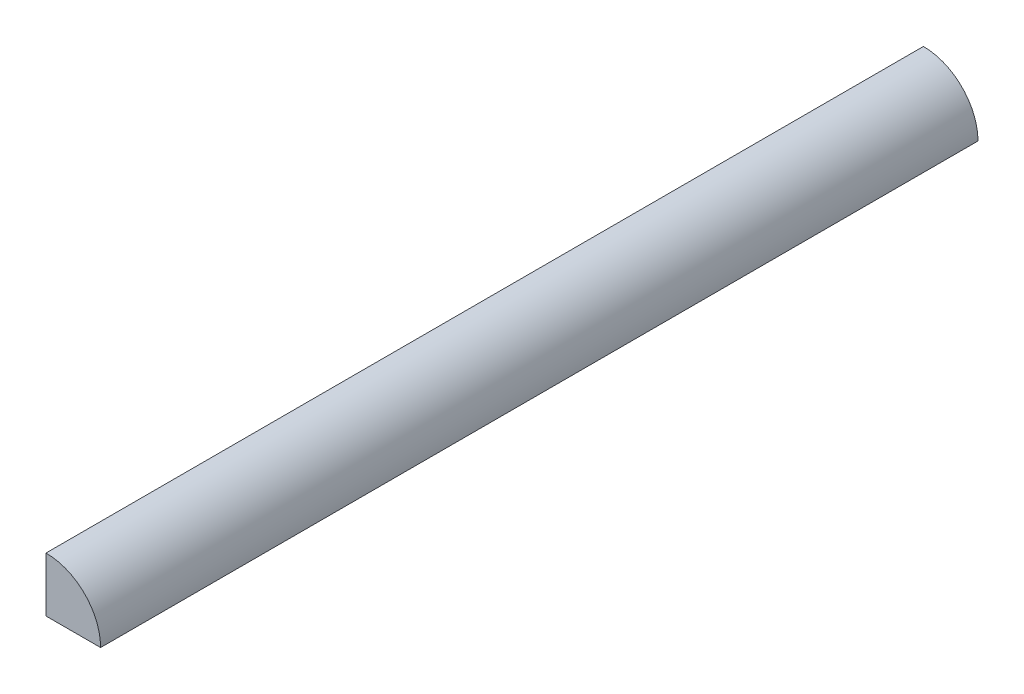
ISO-10303-21;
HEADER;
FILE_DESCRIPTION(('STEP AP214'),'2;1');
FILE_NAME('part.step','',(''),(''),'','','');
FILE_SCHEMA(('AUTOMOTIVE_DESIGN { 1 0 10303 214 1 1 1 1 }'));
ENDSEC;
DATA;
#1=APPLICATION_CONTEXT('core data for automotive mechanical design processes');
#2=APPLICATION_PROTOCOL_DEFINITION('international standard','automotive_design',2000,#1);
#3=PRODUCT_CONTEXT('',#1,'mechanical');
#4=PRODUCT('Part','Part','',(#3));
#5=PRODUCT_RELATED_PRODUCT_CATEGORY('part','',(#4));
#6=PRODUCT_DEFINITION_FORMATION('','',#4);
#7=PRODUCT_DEFINITION_CONTEXT('part definition',#1,'design');
#8=PRODUCT_DEFINITION('design','',#6,#7);
#9=PRODUCT_DEFINITION_SHAPE('','',#8);
#10=(LENGTH_UNIT() NAMED_UNIT(*) SI_UNIT(.MILLI.,.METRE.));
#11=(NAMED_UNIT(*) PLANE_ANGLE_UNIT() SI_UNIT($,.RADIAN.));
#12=(NAMED_UNIT(*) SI_UNIT($,.STERADIAN.) SOLID_ANGLE_UNIT());
#13=UNCERTAINTY_MEASURE_WITH_UNIT(LENGTH_MEASURE(1.E-05),#10,'distance_accuracy_value','');
#14=(GEOMETRIC_REPRESENTATION_CONTEXT(3) GLOBAL_UNCERTAINTY_ASSIGNED_CONTEXT((#13)) GLOBAL_UNIT_ASSIGNED_CONTEXT((#10,
#11,#12)) REPRESENTATION_CONTEXT('',''));
#15=CARTESIAN_POINT('',(0.,0.,0.));
#16=DIRECTION('',(0.,0.,1.));
#17=DIRECTION('',(1.,0.,0.));
#18=AXIS2_PLACEMENT_3D('',#15,#16,#17);
#19=CARTESIAN_POINT('',(0.,-28.,450.));
#20=DIRECTION('',(0.,0.,-1.));
#21=DIRECTION('',(-1.,0.,0.));
#22=AXIS2_PLACEMENT_3D('',#19,#20,#21);
#23=CYLINDRICAL_SURFACE('',#22,28.);
#24=DIRECTION('',(0.,0.,-1.));
#25=VECTOR('',#24,1.);
#26=CARTESIAN_POINT('',(0.,0.,450.));
#27=LINE('',#26,#25);
#28=CARTESIAN_POINT('',(0.,0.,450.));
#29=VERTEX_POINT('',#28);
#30=CARTESIAN_POINT('',(0.,0.,0.));
#31=VERTEX_POINT('',#30);
#32=EDGE_CURVE('E74',#29,#31,#27,.T.);
#33=ORIENTED_EDGE('',*,*,#32,.F.);
#34=CARTESIAN_POINT('',(0.,-28.,450.));
#35=DIRECTION('',(0.,0.,1.));
#36=DIRECTION('',(1.,0.,0.));
#37=AXIS2_PLACEMENT_3D('',#34,#35,#36);
#38=CIRCLE('',#37,28.);
#39=CARTESIAN_POINT('',(28.,-28.,450.));
#40=VERTEX_POINT('',#39);
#41=EDGE_CURVE('E41',#40,#29,#38,.T.);
#42=ORIENTED_EDGE('',*,*,#41,.F.);
#43=DIRECTION('',(0.,0.,-1.));
#44=VECTOR('',#43,1.);
#45=CARTESIAN_POINT('',(28.,-28.,450.));
#46=LINE('',#45,#44);
#47=CARTESIAN_POINT('',(28.,-28.,0.));
#48=VERTEX_POINT('',#47);
#49=EDGE_CURVE('E73',#40,#48,#46,.T.);
#50=ORIENTED_EDGE('',*,*,#49,.T.);
#51=CARTESIAN_POINT('',(0.,-28.,0.));
#52=DIRECTION('',(0.,0.,1.));
#53=DIRECTION('',(1.,0.,0.));
#54=AXIS2_PLACEMENT_3D('',#51,#52,#53);
#55=CIRCLE('',#54,28.);
#56=EDGE_CURVE('E11',#31,#48,#55,.F.);
#57=ORIENTED_EDGE('',*,*,#56,.F.);
#58=EDGE_LOOP('',(#33,#42,#50,#57));
#59=FACE_BOUND('',#58,.T.);
#60=ADVANCED_FACE('F33',(#59),#23,.T.);
#61=CARTESIAN_POINT('',(0.,0.,450.));
#62=DIRECTION('',(1.,0.,0.));
#63=DIRECTION('',(0.,1.,0.));
#64=AXIS2_PLACEMENT_3D('',#61,#62,#63);
#65=PLANE('',#64);
#66=DIRECTION('',(0.,-1.,0.));
#67=VECTOR('',#66,1.);
#68=CARTESIAN_POINT('',(0.,0.,0.));
#69=LINE('',#68,#67);
#70=CARTESIAN_POINT('',(0.,-28.,0.));
#71=VERTEX_POINT('',#70);
#72=EDGE_CURVE('E83',#31,#71,#69,.T.);
#73=ORIENTED_EDGE('',*,*,#72,.T.);
#74=DIRECTION('',(0.,0.,-1.));
#75=VECTOR('',#74,1.);
#76=CARTESIAN_POINT('',(0.,-28.,450.));
#77=LINE('',#76,#75);
#78=CARTESIAN_POINT('',(0.,-28.,450.));
#79=VERTEX_POINT('',#78);
#80=EDGE_CURVE('E71',#79,#71,#77,.T.);
#81=ORIENTED_EDGE('',*,*,#80,.F.);
#82=DIRECTION('',(0.,-1.,0.));
#83=VECTOR('',#82,1.);
#84=CARTESIAN_POINT('',(0.,0.,450.));
#85=LINE('',#84,#83);
#86=EDGE_CURVE('E75',#29,#79,#85,.T.);
#87=ORIENTED_EDGE('',*,*,#86,.F.);
#88=ORIENTED_EDGE('',*,*,#32,.T.);
#89=EDGE_LOOP('',(#73,#81,#87,#88));
#90=FACE_BOUND('',#89,.T.);
#91=ADVANCED_FACE('F82',(#90),#65,.F.);
#92=CARTESIAN_POINT('',(0.,-28.,450.));
#93=DIRECTION('',(0.,1.,0.));
#94=DIRECTION('',(0.,0.,1.));
#95=AXIS2_PLACEMENT_3D('',#92,#93,#94);
#96=PLANE('',#95);
#97=DIRECTION('',(1.,0.,0.));
#98=VECTOR('',#97,1.);
#99=CARTESIAN_POINT('',(0.,-28.,0.));
#100=LINE('',#99,#98);
#101=EDGE_CURVE('E80',#71,#48,#100,.T.);
#102=ORIENTED_EDGE('',*,*,#101,.T.);
#103=ORIENTED_EDGE('',*,*,#49,.F.);
#104=DIRECTION('',(1.,0.,0.));
#105=VECTOR('',#104,1.);
#106=CARTESIAN_POINT('',(0.,-28.,450.));
#107=LINE('',#106,#105);
#108=EDGE_CURVE('E68',#79,#40,#107,.T.);
#109=ORIENTED_EDGE('',*,*,#108,.F.);
#110=ORIENTED_EDGE('',*,*,#80,.T.);
#111=EDGE_LOOP('',(#102,#103,#109,#110));
#112=FACE_BOUND('',#111,.T.);
#113=ADVANCED_FACE('F69',(#112),#96,.F.);
#114=CARTESIAN_POINT('',(0.,0.,450.));
#115=DIRECTION('',(0.,0.,1.));
#116=DIRECTION('',(1.,0.,0.));
#117=AXIS2_PLACEMENT_3D('',#114,#115,#116);
#118=PLANE('',#117);
#119=ORIENTED_EDGE('',*,*,#108,.T.);
#120=ORIENTED_EDGE('',*,*,#41,.T.);
#121=ORIENTED_EDGE('',*,*,#86,.T.);
#122=EDGE_LOOP('',(#119,#120,#121));
#123=FACE_BOUND('',#122,.T.);
#124=ADVANCED_FACE('F78',(#123),#118,.T.);
#125=CARTESIAN_POINT('',(0.,0.,0.));
#126=DIRECTION('',(0.,0.,1.));
#127=DIRECTION('',(1.,0.,0.));
#128=AXIS2_PLACEMENT_3D('',#125,#126,#127);
#129=PLANE('',#128);
#130=ORIENTED_EDGE('',*,*,#72,.F.);
#131=ORIENTED_EDGE('',*,*,#56,.T.);
#132=ORIENTED_EDGE('',*,*,#101,.F.);
#133=EDGE_LOOP('',(#130,#131,#132));
#134=FACE_BOUND('',#133,.T.);
#135=ADVANCED_FACE('F89',(#134),#129,.F.);
#136=CLOSED_SHELL('',(#60,#91,#113,#124,#135));
#137=MANIFOLD_SOLID_BREP('B2',#136);
#138=ADVANCED_BREP_SHAPE_REPRESENTATION('',(#18,#137),#14);
#139=SHAPE_DEFINITION_REPRESENTATION(#9,#138);
ENDSEC;
END-ISO-10303-21;
